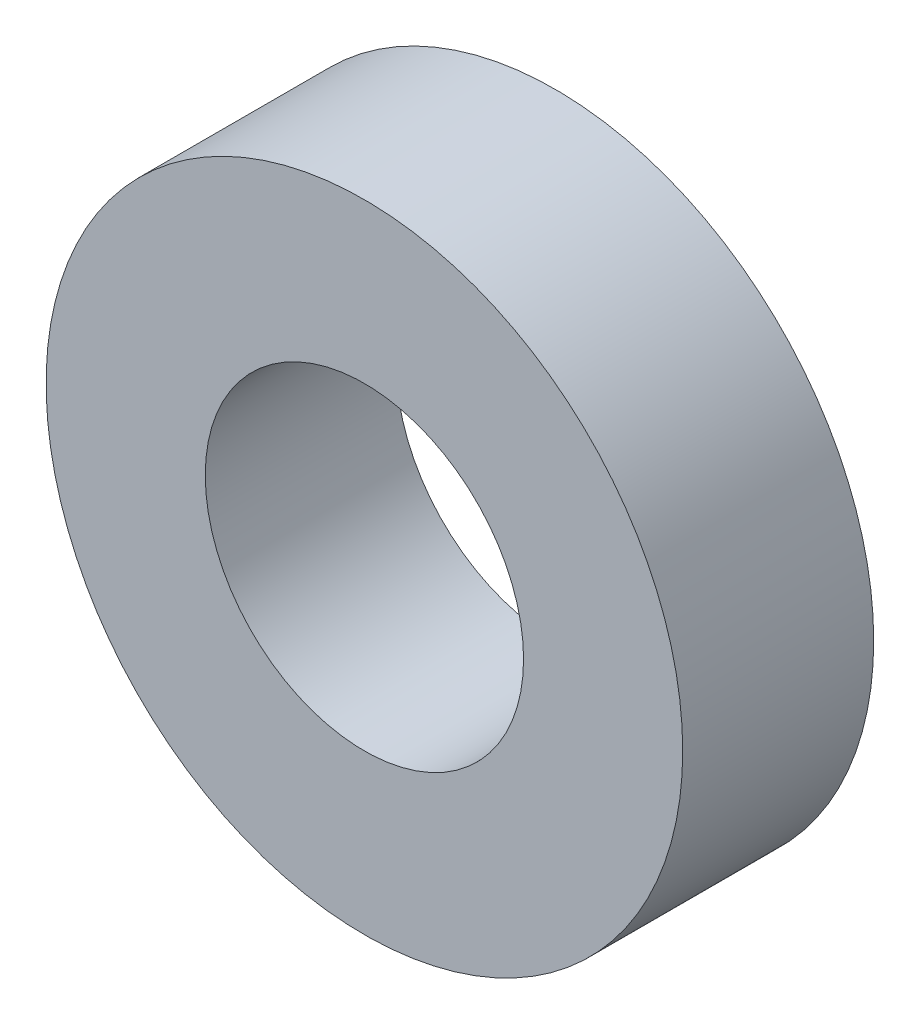
ISO-10303-21;
HEADER;
FILE_DESCRIPTION(('STEP AP214'),'2;1');
FILE_NAME('part.step','',(''),(''),'','','');
FILE_SCHEMA(('AUTOMOTIVE_DESIGN { 1 0 10303 214 1 1 1 1 }'));
ENDSEC;
DATA;
#1=APPLICATION_CONTEXT('core data for automotive mechanical design processes');
#2=APPLICATION_PROTOCOL_DEFINITION('international standard','automotive_design',2000,#1);
#3=PRODUCT_CONTEXT('',#1,'mechanical');
#4=PRODUCT('Part','Part','',(#3));
#5=PRODUCT_RELATED_PRODUCT_CATEGORY('part','',(#4));
#6=PRODUCT_DEFINITION_FORMATION('','',#4);
#7=PRODUCT_DEFINITION_CONTEXT('part definition',#1,'design');
#8=PRODUCT_DEFINITION('design','',#6,#7);
#9=PRODUCT_DEFINITION_SHAPE('','',#8);
#10=(LENGTH_UNIT() NAMED_UNIT(*) SI_UNIT(.MILLI.,.METRE.));
#11=(NAMED_UNIT(*) PLANE_ANGLE_UNIT() SI_UNIT($,.RADIAN.));
#12=(NAMED_UNIT(*) SI_UNIT($,.STERADIAN.) SOLID_ANGLE_UNIT());
#13=UNCERTAINTY_MEASURE_WITH_UNIT(LENGTH_MEASURE(1.E-05),#10,'distance_accuracy_value','');
#14=(GEOMETRIC_REPRESENTATION_CONTEXT(3) GLOBAL_UNCERTAINTY_ASSIGNED_CONTEXT((#13)) GLOBAL_UNIT_ASSIGNED_CONTEXT((#10,
#11,#12)) REPRESENTATION_CONTEXT('',''));
#15=CARTESIAN_POINT('',(0.,0.,0.));
#16=DIRECTION('',(0.,0.,1.));
#17=DIRECTION('',(1.,0.,0.));
#18=AXIS2_PLACEMENT_3D('',#15,#16,#17);
#19=CARTESIAN_POINT('',(0.,0.,3.));
#20=DIRECTION('',(0.,0.,-1.));
#21=DIRECTION('',(-1.,0.,0.));
#22=AXIS2_PLACEMENT_3D('',#19,#20,#21);
#23=CYLINDRICAL_SURFACE('',#22,5.);
#24=CARTESIAN_POINT('',(0.,0.,3.));
#25=DIRECTION('',(0.,0.,1.));
#26=DIRECTION('',(1.,0.,0.));
#27=AXIS2_PLACEMENT_3D('',#24,#25,#26);
#28=CIRCLE('',#27,5.);
#29=CARTESIAN_POINT('',(5.,0.,3.));
#30=VERTEX_POINT('',#29);
#31=EDGE_CURVE('E10',#30,#30,#28,.T.);
#32=ORIENTED_EDGE('',*,*,#31,.F.);
#33=EDGE_LOOP('',(#32));
#34=FACE_BOUND('',#33,.T.);
#35=CARTESIAN_POINT('',(0.,0.,0.));
#36=DIRECTION('',(0.,0.,1.));
#37=DIRECTION('',(1.,0.,0.));
#38=AXIS2_PLACEMENT_3D('',#35,#36,#37);
#39=CIRCLE('',#38,5.);
#40=CARTESIAN_POINT('',(5.,0.,0.));
#41=VERTEX_POINT('',#40);
#42=EDGE_CURVE('E34',#41,#41,#39,.T.);
#43=ORIENTED_EDGE('',*,*,#42,.T.);
#44=EDGE_LOOP('',(#43));
#45=FACE_BOUND('',#44,.T.);
#46=ADVANCED_FACE('F31',(#34,#45),#23,.T.);
#47=CARTESIAN_POINT('',(0.,0.,3.));
#48=DIRECTION('',(0.,0.,1.));
#49=DIRECTION('',(1.,0.,0.));
#50=AXIS2_PLACEMENT_3D('',#47,#48,#49);
#51=PLANE('',#50);
#52=CARTESIAN_POINT('',(0.,0.,3.));
#53=DIRECTION('',(0.,0.,1.));
#54=DIRECTION('',(1.,0.,0.));
#55=AXIS2_PLACEMENT_3D('',#52,#53,#54);
#56=CIRCLE('',#55,2.5);
#57=CARTESIAN_POINT('',(2.5,0.,3.));
#58=VERTEX_POINT('',#57);
#59=EDGE_CURVE('E45',#58,#58,#56,.T.);
#60=ORIENTED_EDGE('',*,*,#59,.F.);
#61=EDGE_LOOP('',(#60));
#62=FACE_BOUND('',#61,.T.);
#63=ORIENTED_EDGE('',*,*,#31,.T.);
#64=EDGE_LOOP('',(#63));
#65=FACE_BOUND('',#64,.T.);
#66=ADVANCED_FACE('F52',(#62,#65),#51,.T.);
#67=CARTESIAN_POINT('',(0.,0.,0.));
#68=DIRECTION('',(0.,0.,1.));
#69=DIRECTION('',(1.,0.,0.));
#70=AXIS2_PLACEMENT_3D('',#67,#68,#69);
#71=PLANE('',#70);
#72=CARTESIAN_POINT('',(0.,0.,0.));
#73=DIRECTION('',(0.,0.,1.));
#74=DIRECTION('',(1.,0.,0.));
#75=AXIS2_PLACEMENT_3D('',#72,#73,#74);
#76=CIRCLE('',#75,2.5);
#77=CARTESIAN_POINT('',(2.5,0.,0.));
#78=VERTEX_POINT('',#77);
#79=EDGE_CURVE('E41',#78,#78,#76,.F.);
#80=ORIENTED_EDGE('',*,*,#79,.F.);
#81=EDGE_LOOP('',(#80));
#82=FACE_BOUND('',#81,.T.);
#83=ORIENTED_EDGE('',*,*,#42,.F.);
#84=EDGE_LOOP('',(#83));
#85=FACE_BOUND('',#84,.T.);
#86=ADVANCED_FACE('F54',(#82,#85),#71,.F.);
#87=CARTESIAN_POINT('',(0.,0.,-0.00100000000000013));
#88=DIRECTION('',(0.,0.,1.));
#89=DIRECTION('',(1.,0.,0.));
#90=AXIS2_PLACEMENT_3D('',#87,#88,#89);
#91=CYLINDRICAL_SURFACE('',#90,2.5);
#92=CARTESIAN_POINT('',(2.5,0.,3.));
#93=CARTESIAN_POINT('',(2.5,0.,2.96875));
#94=CARTESIAN_POINT('',(2.5,0.,2.9375));
#95=CARTESIAN_POINT('',(2.5,0.,2.875));
#96=CARTESIAN_POINT('',(2.5,0.,2.84375));
#97=CARTESIAN_POINT('',(2.5,0.,2.78125));
#98=CARTESIAN_POINT('',(2.5,0.,2.75));
#99=CARTESIAN_POINT('',(2.5,0.,2.6875));
#100=CARTESIAN_POINT('',(2.5,0.,2.65625));
#101=CARTESIAN_POINT('',(2.5,0.,2.59375));
#102=CARTESIAN_POINT('',(2.5,0.,2.5625));
#103=CARTESIAN_POINT('',(2.5,0.,2.5));
#104=CARTESIAN_POINT('',(2.5,0.,2.46875));
#105=CARTESIAN_POINT('',(2.5,0.,2.40625));
#106=CARTESIAN_POINT('',(2.5,0.,2.375));
#107=CARTESIAN_POINT('',(2.5,0.,2.3125));
#108=CARTESIAN_POINT('',(2.5,0.,2.28125));
#109=CARTESIAN_POINT('',(2.5,0.,2.21875));
#110=CARTESIAN_POINT('',(2.5,0.,2.1875));
#111=CARTESIAN_POINT('',(2.5,0.,2.125));
#112=CARTESIAN_POINT('',(2.5,0.,2.09375));
#113=CARTESIAN_POINT('',(2.5,0.,2.03125));
#114=CARTESIAN_POINT('',(2.5,0.,2.));
#115=CARTESIAN_POINT('',(2.5,0.,1.9375));
#116=CARTESIAN_POINT('',(2.5,0.,1.90625));
#117=CARTESIAN_POINT('',(2.5,0.,1.84375));
#118=CARTESIAN_POINT('',(2.5,0.,1.8125));
#119=CARTESIAN_POINT('',(2.5,0.,1.75));
#120=CARTESIAN_POINT('',(2.5,0.,1.71875));
#121=CARTESIAN_POINT('',(2.5,0.,1.65625));
#122=CARTESIAN_POINT('',(2.5,0.,1.625));
#123=CARTESIAN_POINT('',(2.5,0.,1.5625));
#124=CARTESIAN_POINT('',(2.5,0.,1.53125));
#125=CARTESIAN_POINT('',(2.5,0.,1.46875));
#126=CARTESIAN_POINT('',(2.5,0.,1.4375));
#127=CARTESIAN_POINT('',(2.5,0.,1.375));
#128=CARTESIAN_POINT('',(2.5,0.,1.34375));
#129=CARTESIAN_POINT('',(2.5,0.,1.28125));
#130=CARTESIAN_POINT('',(2.5,0.,1.25));
#131=CARTESIAN_POINT('',(2.5,0.,1.1875));
#132=CARTESIAN_POINT('',(2.5,0.,1.15625));
#133=CARTESIAN_POINT('',(2.5,0.,1.09375));
#134=CARTESIAN_POINT('',(2.5,0.,1.0625));
#135=CARTESIAN_POINT('',(2.5,0.,1.));
#136=CARTESIAN_POINT('',(2.5,0.,0.96875));
#137=CARTESIAN_POINT('',(2.5,0.,0.90625));
#138=CARTESIAN_POINT('',(2.5,0.,0.875));
#139=CARTESIAN_POINT('',(2.5,0.,0.8125));
#140=CARTESIAN_POINT('',(2.5,0.,0.78125));
#141=CARTESIAN_POINT('',(2.5,0.,0.71875));
#142=CARTESIAN_POINT('',(2.5,0.,0.6875));
#143=CARTESIAN_POINT('',(2.5,0.,0.625));
#144=CARTESIAN_POINT('',(2.5,0.,0.59375));
#145=CARTESIAN_POINT('',(2.5,0.,0.53125));
#146=CARTESIAN_POINT('',(2.5,0.,0.5));
#147=CARTESIAN_POINT('',(2.5,0.,0.4375));
#148=CARTESIAN_POINT('',(2.5,0.,0.40625));
#149=CARTESIAN_POINT('',(2.5,0.,0.34375));
#150=CARTESIAN_POINT('',(2.5,0.,0.3125));
#151=CARTESIAN_POINT('',(2.5,0.,0.25));
#152=CARTESIAN_POINT('',(2.5,0.,0.21875));
#153=CARTESIAN_POINT('',(2.5,0.,0.15625));
#154=CARTESIAN_POINT('',(2.5,0.,0.125));
#155=CARTESIAN_POINT('',(2.5,0.,0.0625000000000001));
#156=CARTESIAN_POINT('',(2.5,0.,0.0312500000000001));
#157=CARTESIAN_POINT('',(2.5,0.,0.));
#158=B_SPLINE_CURVE_WITH_KNOTS('',3,(#92,#93,#94,#95,#96,#97,#98,#99,#100,#101,#102,#103,#104,
#105,#106,#107,#108,#109,#110,#111,#112,#113,#114,#115,#116,#117,#118,#119,#120,#121,#122,#123,
#124,#125,#126,#127,#128,#129,#130,#131,#132,#133,#134,#135,#136,#137,#138,#139,#140,#141,#142,
#143,#144,#145,#146,#147,#148,#149,#150,#151,#152,#153,#154,#155,#156,#157),.UNSPECIFIED.,.F.,
.F.,(4,2,2,2,2,2,2,2,2,2,2,2,2,2,2,2,2,2,2,2,2,2,2,2,2,2,2,2,2,2,2,2,4),(0.,0.0937500000000001,
0.1875,0.28125,0.375,0.46875,0.5625,0.65625,0.75,0.84375,0.9375,1.03125,1.125,1.21875,1.3125,
1.40625,1.5,1.59375,1.6875,1.78125,1.875,1.96875,2.0625,2.15625,2.25,2.34375,2.4375,2.53125,
2.625,2.71875,2.8125,2.90625,3.),.UNSPECIFIED.);
#159=EDGE_CURVE('BSEAM49',#58,#78,#158,.T.);
#160=ORIENTED_EDGE('',*,*,#59,.T.);
#161=ORIENTED_EDGE('',*,*,#79,.T.);
#162=ORIENTED_EDGE('',*,*,#159,.T.);
#163=ORIENTED_EDGE('',*,*,#159,.F.);
#164=EDGE_LOOP('',(#160,#162,#161,#163));
#165=FACE_BOUND('',#164,.T.);
#166=ADVANCED_FACE('F49',(#165),#91,.F.);
#167=CLOSED_SHELL('',(#46,#66,#86,#166));
#168=MANIFOLD_SOLID_BREP('B2',#167);
#169=ADVANCED_BREP_SHAPE_REPRESENTATION('',(#18,#168),#14);
#170=SHAPE_DEFINITION_REPRESENTATION(#9,#169);
ENDSEC;
END-ISO-10303-21;
